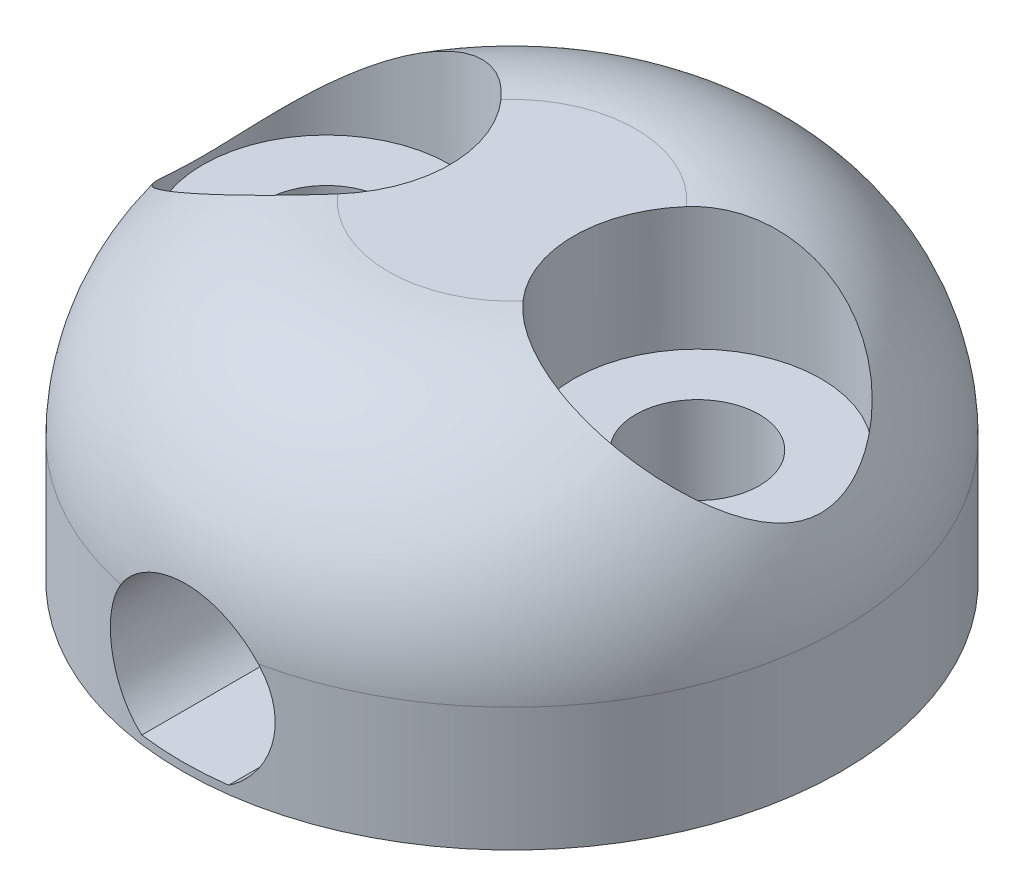
ISO-10303-21;
HEADER;
FILE_DESCRIPTION(('STEP AP214'),'2;1');
FILE_NAME('part.step','',(''),(''),'','','');
FILE_SCHEMA(('AUTOMOTIVE_DESIGN { 1 0 10303 214 1 1 1 1 }'));
ENDSEC;
DATA;
#1=APPLICATION_CONTEXT('core data for automotive mechanical design processes');
#2=APPLICATION_PROTOCOL_DEFINITION('international standard','automotive_design',2000,#1);
#3=PRODUCT_CONTEXT('',#1,'mechanical');
#4=PRODUCT('Part','Part','',(#3));
#5=PRODUCT_RELATED_PRODUCT_CATEGORY('part','',(#4));
#6=PRODUCT_DEFINITION_FORMATION('','',#4);
#7=PRODUCT_DEFINITION_CONTEXT('part definition',#1,'design');
#8=PRODUCT_DEFINITION('design','',#6,#7);
#9=PRODUCT_DEFINITION_SHAPE('','',#8);
#10=(LENGTH_UNIT() NAMED_UNIT(*) SI_UNIT(.MILLI.,.METRE.));
#11=(NAMED_UNIT(*) PLANE_ANGLE_UNIT() SI_UNIT($,.RADIAN.));
#12=(NAMED_UNIT(*) SI_UNIT($,.STERADIAN.) SOLID_ANGLE_UNIT());
#13=UNCERTAINTY_MEASURE_WITH_UNIT(LENGTH_MEASURE(1.E-05),#10,'distance_accuracy_value','');
#14=(GEOMETRIC_REPRESENTATION_CONTEXT(3) GLOBAL_UNCERTAINTY_ASSIGNED_CONTEXT((#13)) GLOBAL_UNIT_ASSIGNED_CONTEXT((#10,
#11,#12)) REPRESENTATION_CONTEXT('',''));
#15=CARTESIAN_POINT('',(0.,0.,0.));
#16=DIRECTION('',(0.,0.,1.));
#17=DIRECTION('',(1.,0.,0.));
#18=AXIS2_PLACEMENT_3D('',#15,#16,#17);
#19=CARTESIAN_POINT('',(-4.5,8.,0.));
#20=DIRECTION('',(0.,-1.,0.));
#21=DIRECTION('',(0.,0.,-1.));
#22=AXIS2_PLACEMENT_3D('',#19,#20,#21);
#23=CYLINDRICAL_SURFACE('',#22,1.5);
#24=CARTESIAN_POINT('',(-4.5,5.,0.));
#25=DIRECTION('',(0.,1.,0.));
#26=DIRECTION('',(0.,0.,1.));
#27=AXIS2_PLACEMENT_3D('',#24,#25,#26);
#28=CIRCLE('',#27,1.5);
#29=CARTESIAN_POINT('',(-4.5,5.,1.5));
#30=VERTEX_POINT('',#29);
#31=EDGE_CURVE('E154',#30,#30,#28,.T.);
#32=ORIENTED_EDGE('',*,*,#31,.T.);
#33=EDGE_LOOP('',(#32));
#34=FACE_BOUND('',#33,.T.);
#35=CARTESIAN_POINT('',(-4.5,0.2,0.));
#36=DIRECTION('',(0.,-1.,0.));
#37=DIRECTION('',(0.,0.,-1.));
#38=AXIS2_PLACEMENT_3D('',#35,#36,#37);
#39=CIRCLE('',#38,1.5);
#40=CARTESIAN_POINT('',(-4.5,0.2,-1.5));
#41=VERTEX_POINT('',#40);
#42=EDGE_CURVE('E176',#41,#41,#39,.T.);
#43=ORIENTED_EDGE('',*,*,#42,.T.);
#44=EDGE_LOOP('',(#43));
#45=FACE_BOUND('',#44,.T.);
#46=ADVANCED_FACE('F33',(#34,#45),#23,.F.);
#47=CARTESIAN_POINT('',(4.5,8.,0.));
#48=DIRECTION('',(0.,-1.,0.));
#49=DIRECTION('',(0.,0.,-1.));
#50=AXIS2_PLACEMENT_3D('',#47,#48,#49);
#51=CYLINDRICAL_SURFACE('',#50,1.5);
#52=CARTESIAN_POINT('',(4.5,5.,0.));
#53=DIRECTION('',(0.,1.,0.));
#54=DIRECTION('',(0.,0.,1.));
#55=AXIS2_PLACEMENT_3D('',#52,#53,#54);
#56=CIRCLE('',#55,1.5);
#57=CARTESIAN_POINT('',(4.5,5.,1.5));
#58=VERTEX_POINT('',#57);
#59=EDGE_CURVE('E158',#58,#58,#56,.T.);
#60=ORIENTED_EDGE('',*,*,#59,.T.);
#61=EDGE_LOOP('',(#60));
#62=FACE_BOUND('',#61,.T.);
#63=CARTESIAN_POINT('',(4.5,0.2,0.));
#64=DIRECTION('',(0.,-1.,0.));
#65=DIRECTION('',(0.,0.,-1.));
#66=AXIS2_PLACEMENT_3D('',#63,#64,#65);
#67=CIRCLE('',#66,1.5);
#68=CARTESIAN_POINT('',(4.5,0.2,-1.5));
#69=VERTEX_POINT('',#68);
#70=EDGE_CURVE('E151',#69,#69,#67,.T.);
#71=ORIENTED_EDGE('',*,*,#70,.T.);
#72=EDGE_LOOP('',(#71));
#73=FACE_BOUND('',#72,.T.);
#74=ADVANCED_FACE('F130',(#62,#73),#51,.F.);
#75=CARTESIAN_POINT('',(0.,1.9,-20.));
#76=DIRECTION('',(0.,0.,1.));
#77=DIRECTION('',(1.,0.,0.));
#78=AXIS2_PLACEMENT_3D('',#75,#76,#77);
#79=CYLINDRICAL_SURFACE('',#78,2.);
#80=DIRECTION('',(0.,0.,1.));
#81=VECTOR('',#80,1.);
#82=CARTESIAN_POINT('',(1.05356537528527,0.2,-20.));
#83=LINE('',#82,#81);
#84=CARTESIAN_POINT('',(1.05356537528527,0.2,7.93032155716273));
#85=VERTEX_POINT('',#84);
#86=CARTESIAN_POINT('',(1.05356537528527,0.2,-7.93032155716273));
#87=VERTEX_POINT('',#86);
#88=EDGE_CURVE('E11',#85,#87,#83,.F.);
#89=ORIENTED_EDGE('',*,*,#88,.F.);
#90=CARTESIAN_POINT('',(-0.62449979983984,0.,7.97558775263616));
#91=CARTESIAN_POINT('',(-0.678149129335903,0.0176338708204838,7.97138952109277));
#92=CARTESIAN_POINT('',(-0.730988103930921,0.0375201759389581,7.96670445516339));
#93=CARTESIAN_POINT('',(-0.834722214890457,0.0816441585373171,7.95650348799234));
#94=CARTESIAN_POINT('',(-0.885617719784912,0.105881006027599,7.95098774525815));
#95=CARTESIAN_POINT('',(-1.03473646986106,0.184793652290598,7.93342930658351));
#96=CARTESIAN_POINT('',(-1.12960818115426,0.245743039353849,7.9203575369683));
#97=CARTESIAN_POINT('',(-1.30761657189999,0.382516823465673,7.89292597702519));
#98=CARTESIAN_POINT('',(-1.39075491423208,0.458339109046076,7.87856636968526));
#99=CARTESIAN_POINT('',(-1.54321390243567,0.622869434850874,7.85012801299076));
#100=CARTESIAN_POINT('',(-1.61253356298505,0.71157839316272,7.83604928372819));
#101=CARTESIAN_POINT('',(-1.73604150350963,0.900489647836725,7.80962250525773));
#102=CARTESIAN_POINT('',(-1.79007366230755,1.00079675441443,7.79729291199089));
#103=CARTESIAN_POINT('',(-1.88043505641346,1.20943415952048,7.77599722688484));
#104=CARTESIAN_POINT('',(-1.91676591547244,1.31776372109357,7.76703082655527));
#105=CARTESIAN_POINT('',(-1.96997277466503,1.53710802979521,7.7537057006627));
#106=CARTESIAN_POINT('',(-1.98721818757998,1.64802774001858,7.74925962426297));
#107=CARTESIAN_POINT('',(-2.00292006881191,1.87126476685026,7.74521670418808));
#108=CARTESIAN_POINT('',(-2.00138028565928,1.98358180015833,7.74561889305572));
#109=CARTESIAN_POINT('',(-1.97984577158778,2.20351813997541,7.75114978848514));
#110=CARTESIAN_POINT('',(-1.96030361939172,2.3111851437969,7.75616257990297));
#111=CARTESIAN_POINT('',(-1.90404981227494,2.52166167717302,7.77016256734981));
#112=CARTESIAN_POINT('',(-1.86733675771861,2.62447081000029,7.77915008736387));
#113=CARTESIAN_POINT('',(-1.77742692977357,2.82346693213446,7.80018550940365));
#114=CARTESIAN_POINT('',(-1.72407436617985,2.9195803669078,7.81226213300263));
#115=CARTESIAN_POINT('',(-1.60250667793686,3.10164869791587,7.83810075600036));
#116=CARTESIAN_POINT('',(-1.53428901164841,3.18760185306202,7.85186304343793));
#117=CARTESIAN_POINT('',(-1.38261622441132,3.34949030371311,7.88000486237123));
#118=CARTESIAN_POINT('',(-1.29878144979904,3.42506922763394,7.89439079510434));
#119=CARTESIAN_POINT('',(-1.11946181887999,3.56116671678368,7.92180658273681));
#120=CARTESIAN_POINT('',(-1.02397655646946,3.62168475680824,7.93483639033606));
#121=CARTESIAN_POINT('',(-0.823510340305419,3.7261022057381,7.95814294692834));
#122=CARTESIAN_POINT('',(-0.718494022199052,3.76993630420429,7.96840883141241));
#123=CARTESIAN_POINT('',(-0.502269250813925,3.83922856929184,7.98495247709832));
#124=CARTESIAN_POINT('',(-0.391061982585458,3.86469023976127,7.99123099871194));
#125=CARTESIAN_POINT('',(-0.168646637723676,3.8959580104626,7.99897645571015));
#126=CARTESIAN_POINT('',(-0.0575105914191628,3.90224779022084,8.00056176389966));
#127=CARTESIAN_POINT('',(0.164229199224711,3.89632834875157,7.99908233024459));
#128=CARTESIAN_POINT('',(0.274832991846246,3.88412083845255,7.99601801847203));
#129=CARTESIAN_POINT('',(0.490634151381134,3.84195388834336,7.98566094348375));
#130=CARTESIAN_POINT('',(0.595888074450275,3.81226649988497,7.97843301801472));
#131=CARTESIAN_POINT('',(0.79991406809078,3.73629807599584,7.96056746453128));
#132=CARTESIAN_POINT('',(0.89868549198035,3.69001538801719,7.94992949695854));
#133=CARTESIAN_POINT('',(1.08885009494479,3.58125324198456,7.92614386401596));
#134=CARTESIAN_POINT('',(1.18008464247959,3.51850550617499,7.91295568223272));
#135=CARTESIAN_POINT('',(1.35090120441893,3.37893063427777,7.88559205638182));
#136=CARTESIAN_POINT('',(1.43048121423665,3.30210108121463,7.87141644309269));
#137=CARTESIAN_POINT('',(1.57775835209973,3.13427939332037,7.84324227492578));
#138=CARTESIAN_POINT('',(1.64511310393349,3.04298410720222,7.82925675944008));
#139=CARTESIAN_POINT('',(1.7635499306507,2.85010363984169,7.80343387023057));
#140=CARTESIAN_POINT('',(1.81463258658533,2.74851882619308,7.79159641980918));
#141=CARTESIAN_POINT('',(1.89871675181714,2.53843682964764,7.77153426173014));
#142=CARTESIAN_POINT('',(1.93181759620394,2.42998139583795,7.76328975701963));
#143=CARTESIAN_POINT('',(1.9792479234238,2.20880731659754,7.75133452293179));
#144=CARTESIAN_POINT('',(1.99358177601552,2.09608966988362,7.74762273815687));
#145=CARTESIAN_POINT('',(2.00284139579692,1.87306185683508,7.74523374524784));
#146=CARTESIAN_POINT('',(1.99831283676291,1.76277554266662,7.74641498061502));
#147=CARTESIAN_POINT('',(1.97123502093836,1.5445888867123,7.75334920658874));
#148=CARTESIAN_POINT('',(1.94868569070461,1.43668855465229,7.75910221582743));
#149=CARTESIAN_POINT('',(1.88651560478662,1.22698777986888,7.77444957412282));
#150=CARTESIAN_POINT('',(1.84700529741727,1.12515264474785,7.78401904261951));
#151=CARTESIAN_POINT('',(1.75212221074548,0.929487455070735,7.80592262429375));
#152=CARTESIAN_POINT('',(1.69674733361861,0.83565846132414,7.81825710305078));
#153=CARTESIAN_POINT('',(1.57000905230004,0.656028157162892,7.84470254219912));
#154=CARTESIAN_POINT('',(1.49826638752489,0.570499972753037,7.8588514388833));
#155=CARTESIAN_POINT('',(1.3415883150242,0.412546838452256,7.88710757512615));
#156=CARTESIAN_POINT('',(1.25665436092456,0.340120446698962,7.90121481910043));
#157=CARTESIAN_POINT('',(1.08378054493429,0.21604484346309,7.92668565083606));
#158=CARTESIAN_POINT('',(0.996776295410648,0.163122193756207,7.93818161951458));
#159=CARTESIAN_POINT('',(0.860894728808642,0.0940511090518631,7.95367523156273));
#160=CARTESIAN_POINT('',(0.81468115982457,0.0727383557995359,7.95854999489001));
#161=CARTESIAN_POINT('',(0.72069748029579,0.0336709209253033,7.96761126367671));
#162=CARTESIAN_POINT('',(0.672927049067981,0.015916977802848,7.97179762625168));
#163=CARTESIAN_POINT('',(0.62449979983984,0.,7.97558775263616));
#164=B_SPLINE_CURVE_WITH_KNOTS('',3,(#90,#91,#92,#93,#94,#95,#96,#97,#98,#99,#100,#101,#102,
#103,#104,#105,#106,#107,#108,#109,#110,#111,#112,#113,#114,#115,#116,#117,#118,#119,#120,#121,
#122,#123,#124,#125,#126,#127,#128,#129,#130,#131,#132,#133,#134,#135,#136,#137,#138,#139,#140,
#141,#142,#143,#144,#145,#146,#147,#148,#149,#150,#151,#152,#153,#154,#155,#156,#157,#158,#159,
#160,#161,#162,#163),.UNSPECIFIED.,.F.,.F.,(4,2,2,2,2,2,2,2,2,2,2,2,2,2,2,2,2,2,2,2,2,2,2,2,2,2,
2,2,2,2,2,2,2,2,2,2,4),(0.,0.169775823606109,0.339519292006739,0.678329792225753,
1.01709222713343,1.35587880839866,1.69800965559001,2.04010911299956,2.37546443342145,
2.7107528357744,3.03783557003932,3.36494497013899,3.69521390243794,4.02553934857664,
4.36530224823981,4.70507699448241,5.04616845788945,5.38719485375251,5.71954330081126,
6.05186100878804,6.37913846056119,6.70644851144086,7.03946422650503,7.37253715335021,
7.71384367977885,8.05513801731667,8.39452729275183,8.73383752978051,9.06340101174411,
9.39296583684271,9.72041636756288,10.0479102181487,10.3839437066388,10.7199401918574,
11.0261197680304,11.1793590762489,11.3326301507749),.UNSPECIFIED.);
#165=CARTESIAN_POINT('',(1.67032930884901,3.,7.82368199762746));
#166=VERTEX_POINT('',#165);
#167=EDGE_CURVE('E150',#166,#85,#164,.T.);
#168=ORIENTED_EDGE('',*,*,#167,.F.);
#169=CARTESIAN_POINT('',(1.67032930884901,3.,7.82368199762746));
#170=CARTESIAN_POINT('',(1.63974251917367,3.04644603889821,7.83021288302331));
#171=CARTESIAN_POINT('',(1.6072032091388,3.09163550278727,7.83630939706052));
#172=CARTESIAN_POINT('',(1.53841904952875,3.17920658150868,7.84768511472171));
#173=CARTESIAN_POINT('',(1.50217436934382,3.22158832454956,7.85296435567944));
#174=CARTESIAN_POINT('',(1.38830477431373,3.34394890242695,7.86763768048863));
#175=CARTESIAN_POINT('',(1.30544012802177,3.41930117699998,7.87588896965515));
#176=CARTESIAN_POINT('',(1.12816855248475,3.55521434691073,7.88979213570129));
#177=CARTESIAN_POINT('',(1.03375584169712,3.61576778734984,7.89544270373081));
#178=CARTESIAN_POINT('',(0.836076546342191,3.72029313464337,7.90464621969626));
#179=CARTESIAN_POINT('',(0.732811785173716,3.76426844633533,7.90819959844051));
#180=CARTESIAN_POINT('',(0.520312858595372,3.8343732360506,7.91364308769088));
#181=CARTESIAN_POINT('',(0.411076477658144,3.86049604142641,7.91553257636866));
#182=CARTESIAN_POINT('',(0.189734689434183,3.89412479271695,7.91793433448282));
#183=CARTESIAN_POINT('',(0.0776286429377334,3.90162655374206,7.91844629433583));
#184=CARTESIAN_POINT('',(-0.146459806863289,3.89778119133218,7.9181785857226));
#185=CARTESIAN_POINT('',(-0.258441628602604,3.886400266802,7.9173966010278));
#186=CARTESIAN_POINT('',(-0.478881350600388,3.84505681992554,7.91440549328976));
#187=CARTESIAN_POINT('',(-0.587339866659163,3.81509756327329,7.91219662106156));
#188=CARTESIAN_POINT('',(-0.797674918103802,3.73746609987292,7.90602659387854));
#189=CARTESIAN_POINT('',(-0.899551132136076,3.68979302908719,7.90206535344558));
#190=CARTESIAN_POINT('',(-1.09381406336721,3.57813072978673,7.89193280886461));
#191=CARTESIAN_POINT('',(-1.18620065308591,3.51414128212393,7.88576147503202));
#192=CARTESIAN_POINT('',(-1.349535720118,3.37943068345248,7.87151344375509));
#193=CARTESIAN_POINT('',(-1.42172173442734,3.31018042674242,7.86371411365722));
#194=CARTESIAN_POINT('',(-1.52151879650722,3.19902581189728,7.85015474124726));
#195=CARTESIAN_POINT('',(-1.55337814138417,3.16074996042402,7.84532336054342));
#196=CARTESIAN_POINT('',(-1.61412184646069,3.08198289988643,7.83500405425471));
#197=CARTESIAN_POINT('',(-1.64300587680294,3.04149144595035,7.82951605601962));
#198=CARTESIAN_POINT('',(-1.67032930884901,3.,7.82368199762746));
#199=B_SPLINE_CURVE_WITH_KNOTS('',3,(#169,#170,#171,#172,#173,#174,#175,#176,#177,#178,#179,
#180,#181,#182,#183,#184,#185,#186,#187,#188,#189,#190,#191,#192,#193,#194,#195,#196,#197,#198),
.UNSPECIFIED.,.F.,.F.,(4,2,2,2,2,2,2,2,2,2,2,2,2,2,4),(0.,0.167882493564761,0.3357573158445,
0.670942577401621,1.00629634177959,1.34158119319558,1.67699129401933,2.01247676801691,
2.34856342850184,2.68459102850685,3.02063502128871,3.35668352777298,3.65647972827028,
3.80645733492145,3.95645155093791),.UNSPECIFIED.);
#200=CARTESIAN_POINT('',(-1.67032930884901,3.,7.82368199762746));
#201=VERTEX_POINT('',#200);
#202=EDGE_CURVE('E49',#166,#201,#199,.T.);
#203=ORIENTED_EDGE('',*,*,#202,.T.);
#204=CARTESIAN_POINT('',(-1.05356537528527,0.2,7.93032155716273));
#205=VERTEX_POINT('',#204);
#206=EDGE_CURVE('E57',#205,#201,#164,.T.);
#207=ORIENTED_EDGE('',*,*,#206,.F.);
#208=DIRECTION('',(0.,0.,1.));
#209=VECTOR('',#208,1.);
#210=CARTESIAN_POINT('',(-1.05356537528527,0.2,-20.));
#211=LINE('',#210,#209);
#212=CARTESIAN_POINT('',(-1.05356537528527,0.2,-7.93032155716273));
#213=VERTEX_POINT('',#212);
#214=EDGE_CURVE('E42',#213,#205,#211,.T.);
#215=ORIENTED_EDGE('',*,*,#214,.F.);
#216=CARTESIAN_POINT('',(0.62449979983984,0.,-7.97558775263616));
#217=CARTESIAN_POINT('',(0.678149129335903,0.0176338708204838,-7.97138952109277));
#218=CARTESIAN_POINT('',(0.730988103930921,0.0375201759389581,-7.96670445516339));
#219=CARTESIAN_POINT('',(0.834722214890457,0.0816441585373171,-7.95650348799234));
#220=CARTESIAN_POINT('',(0.885617719784912,0.105881006027599,-7.95098774525815));
#221=CARTESIAN_POINT('',(1.03473646986106,0.184793652290598,-7.93342930658351));
#222=CARTESIAN_POINT('',(1.12960818115426,0.245743039353849,-7.9203575369683));
#223=CARTESIAN_POINT('',(1.30761657189999,0.382516823465673,-7.89292597702519));
#224=CARTESIAN_POINT('',(1.39075491423208,0.458339109046076,-7.87856636968526));
#225=CARTESIAN_POINT('',(1.54321390243567,0.622869434850874,-7.85012801299076));
#226=CARTESIAN_POINT('',(1.61253356298505,0.71157839316272,-7.83604928372819));
#227=CARTESIAN_POINT('',(1.73604150350963,0.900489647836725,-7.80962250525773));
#228=CARTESIAN_POINT('',(1.79007366230755,1.00079675441443,-7.79729291199089));
#229=CARTESIAN_POINT('',(1.88043505641346,1.20943415952048,-7.77599722688484));
#230=CARTESIAN_POINT('',(1.91676591547244,1.31776372109357,-7.76703082655527));
#231=CARTESIAN_POINT('',(1.96997277466503,1.53710802979521,-7.7537057006627));
#232=CARTESIAN_POINT('',(1.98721818757998,1.64802774001858,-7.74925962426297));
#233=CARTESIAN_POINT('',(2.00292006881191,1.87126476685026,-7.74521670418808));
#234=CARTESIAN_POINT('',(2.00138028565928,1.98358180015833,-7.74561889305572));
#235=CARTESIAN_POINT('',(1.97984577158778,2.20351813997541,-7.75114978848514));
#236=CARTESIAN_POINT('',(1.96030361939172,2.3111851437969,-7.75616257990297));
#237=CARTESIAN_POINT('',(1.90404981227494,2.52166167717302,-7.77016256734981));
#238=CARTESIAN_POINT('',(1.86733675771861,2.62447081000029,-7.77915008736387));
#239=CARTESIAN_POINT('',(1.77742692977357,2.82346693213446,-7.80018550940365));
#240=CARTESIAN_POINT('',(1.72407436617985,2.9195803669078,-7.81226213300263));
#241=CARTESIAN_POINT('',(1.60250667793686,3.10164869791587,-7.83810075600036));
#242=CARTESIAN_POINT('',(1.53428901164841,3.18760185306202,-7.85186304343793));
#243=CARTESIAN_POINT('',(1.38261622441132,3.34949030371311,-7.88000486237123));
#244=CARTESIAN_POINT('',(1.29878144979904,3.42506922763394,-7.89439079510434));
#245=CARTESIAN_POINT('',(1.11946181887999,3.56116671678368,-7.92180658273681));
#246=CARTESIAN_POINT('',(1.02397655646946,3.62168475680824,-7.93483639033606));
#247=CARTESIAN_POINT('',(0.823510340305419,3.7261022057381,-7.95814294692834));
#248=CARTESIAN_POINT('',(0.718494022199052,3.76993630420429,-7.96840883141241));
#249=CARTESIAN_POINT('',(0.502269250813925,3.83922856929184,-7.98495247709832));
#250=CARTESIAN_POINT('',(0.391061982585458,3.86469023976127,-7.99123099871194));
#251=CARTESIAN_POINT('',(0.168646637723676,3.8959580104626,-7.99897645571015));
#252=CARTESIAN_POINT('',(0.0575105914191628,3.90224779022084,-8.00056176389966));
#253=CARTESIAN_POINT('',(-0.164229199224711,3.89632834875157,-7.99908233024459));
#254=CARTESIAN_POINT('',(-0.274832991846246,3.88412083845255,-7.99601801847203));
#255=CARTESIAN_POINT('',(-0.490634151381134,3.84195388834336,-7.98566094348375));
#256=CARTESIAN_POINT('',(-0.595888074450275,3.81226649988497,-7.97843301801472));
#257=CARTESIAN_POINT('',(-0.79991406809078,3.73629807599584,-7.96056746453128));
#258=CARTESIAN_POINT('',(-0.89868549198035,3.69001538801719,-7.94992949695854));
#259=CARTESIAN_POINT('',(-1.08885009494479,3.58125324198456,-7.92614386401596));
#260=CARTESIAN_POINT('',(-1.18008464247959,3.51850550617499,-7.91295568223272));
#261=CARTESIAN_POINT('',(-1.35090120441893,3.37893063427777,-7.88559205638182));
#262=CARTESIAN_POINT('',(-1.43048121423665,3.30210108121463,-7.87141644309269));
#263=CARTESIAN_POINT('',(-1.57775835209973,3.13427939332037,-7.84324227492578));
#264=CARTESIAN_POINT('',(-1.64511310393349,3.04298410720222,-7.82925675944008));
#265=CARTESIAN_POINT('',(-1.7635499306507,2.85010363984169,-7.80343387023057));
#266=CARTESIAN_POINT('',(-1.81463258658533,2.74851882619308,-7.79159641980918));
#267=CARTESIAN_POINT('',(-1.89871675181714,2.53843682964764,-7.77153426173014));
#268=CARTESIAN_POINT('',(-1.93181759620394,2.42998139583795,-7.76328975701963));
#269=CARTESIAN_POINT('',(-1.9792479234238,2.20880731659754,-7.75133452293179));
#270=CARTESIAN_POINT('',(-1.99358177601552,2.09608966988362,-7.74762273815687));
#271=CARTESIAN_POINT('',(-2.00284139579692,1.87306185683508,-7.74523374524784));
#272=CARTESIAN_POINT('',(-1.99831283676291,1.76277554266662,-7.74641498061502));
#273=CARTESIAN_POINT('',(-1.97123502093836,1.5445888867123,-7.75334920658874));
#274=CARTESIAN_POINT('',(-1.94868569070461,1.43668855465229,-7.75910221582743));
#275=CARTESIAN_POINT('',(-1.88651560478662,1.22698777986888,-7.77444957412282));
#276=CARTESIAN_POINT('',(-1.84700529741727,1.12515264474785,-7.78401904261951));
#277=CARTESIAN_POINT('',(-1.75212221074548,0.929487455070735,-7.80592262429375));
#278=CARTESIAN_POINT('',(-1.69674733361861,0.83565846132414,-7.81825710305078));
#279=CARTESIAN_POINT('',(-1.57000905230004,0.656028157162892,-7.84470254219912));
#280=CARTESIAN_POINT('',(-1.49826638752489,0.570499972753037,-7.8588514388833));
#281=CARTESIAN_POINT('',(-1.3415883150242,0.412546838452256,-7.88710757512615));
#282=CARTESIAN_POINT('',(-1.25665436092456,0.340120446698962,-7.90121481910043));
#283=CARTESIAN_POINT('',(-1.08378054493429,0.21604484346309,-7.92668565083606));
#284=CARTESIAN_POINT('',(-0.996776295410648,0.163122193756207,-7.93818161951458));
#285=CARTESIAN_POINT('',(-0.860894728808642,0.0940511090518631,-7.95367523156273));
#286=CARTESIAN_POINT('',(-0.81468115982457,0.0727383557995359,-7.95854999489001));
#287=CARTESIAN_POINT('',(-0.72069748029579,0.0336709209253033,-7.96761126367671));
#288=CARTESIAN_POINT('',(-0.672927049067981,0.015916977802848,-7.97179762625168));
#289=CARTESIAN_POINT('',(-0.62449979983984,0.,-7.97558775263616));
#290=B_SPLINE_CURVE_WITH_KNOTS('',3,(#216,#217,#218,#219,#220,#221,#222,#223,#224,#225,#226,
#227,#228,#229,#230,#231,#232,#233,#234,#235,#236,#237,#238,#239,#240,#241,#242,#243,#244,#245,
#246,#247,#248,#249,#250,#251,#252,#253,#254,#255,#256,#257,#258,#259,#260,#261,#262,#263,#264,
#265,#266,#267,#268,#269,#270,#271,#272,#273,#274,#275,#276,#277,#278,#279,#280,#281,#282,#283,
#284,#285,#286,#287,#288,#289),.UNSPECIFIED.,.F.,.F.,(4,2,2,2,2,2,2,2,2,2,2,2,2,2,2,2,2,2,2,2,2,
2,2,2,2,2,2,2,2,2,2,2,2,2,2,2,4),(0.,0.169775823606109,0.339519292006739,0.678329792225753,
1.01709222713343,1.35587880839866,1.69800965559001,2.04010911299956,2.37546443342145,
2.7107528357744,3.03783557003932,3.36494497013899,3.69521390243794,4.02553934857664,
4.36530224823981,4.70507699448241,5.04616845788945,5.38719485375251,5.71954330081126,
6.05186100878804,6.37913846056119,6.70644851144086,7.03946422650503,7.37253715335021,
7.71384367977885,8.05513801731667,8.39452729275183,8.73383752978051,9.06340101174411,
9.39296583684271,9.72041636756288,10.0479102181487,10.3839437066388,10.7199401918574,
11.0261197680304,11.1793590762489,11.3326301507749),.UNSPECIFIED.);
#291=CARTESIAN_POINT('',(-1.67032930884901,3.,-7.82368199762746));
#292=VERTEX_POINT('',#291);
#293=EDGE_CURVE('E102',#292,#213,#290,.T.);
#294=ORIENTED_EDGE('',*,*,#293,.F.);
#295=CARTESIAN_POINT('',(-1.67032930884901,3.,-7.82368199762746));
#296=CARTESIAN_POINT('',(-1.63974251917367,3.04644603889821,-7.83021288302331));
#297=CARTESIAN_POINT('',(-1.6072032091388,3.09163550278727,-7.83630939706052));
#298=CARTESIAN_POINT('',(-1.53841904952875,3.17920658150868,-7.84768511472171));
#299=CARTESIAN_POINT('',(-1.50217436934382,3.22158832454956,-7.85296435567944));
#300=CARTESIAN_POINT('',(-1.38830477431373,3.34394890242695,-7.86763768048863));
#301=CARTESIAN_POINT('',(-1.30544012802177,3.41930117699998,-7.87588896965515));
#302=CARTESIAN_POINT('',(-1.12816855248475,3.55521434691073,-7.88979213570129));
#303=CARTESIAN_POINT('',(-1.03375584169712,3.61576778734984,-7.89544270373081));
#304=CARTESIAN_POINT('',(-0.836076546342191,3.72029313464337,-7.90464621969626));
#305=CARTESIAN_POINT('',(-0.732811785173716,3.76426844633533,-7.90819959844051));
#306=CARTESIAN_POINT('',(-0.520312858595372,3.8343732360506,-7.91364308769088));
#307=CARTESIAN_POINT('',(-0.411076477658144,3.86049604142641,-7.91553257636866));
#308=CARTESIAN_POINT('',(-0.189734689434183,3.89412479271695,-7.91793433448282));
#309=CARTESIAN_POINT('',(-0.0776286429377334,3.90162655374206,-7.91844629433583));
#310=CARTESIAN_POINT('',(0.146459806863289,3.89778119133218,-7.9181785857226));
#311=CARTESIAN_POINT('',(0.258441628602604,3.886400266802,-7.9173966010278));
#312=CARTESIAN_POINT('',(0.478881350600388,3.84505681992554,-7.91440549328976));
#313=CARTESIAN_POINT('',(0.587339866659163,3.81509756327329,-7.91219662106156));
#314=CARTESIAN_POINT('',(0.797674918103802,3.73746609987292,-7.90602659387854));
#315=CARTESIAN_POINT('',(0.899551132136076,3.68979302908719,-7.90206535344558));
#316=CARTESIAN_POINT('',(1.09381406336721,3.57813072978673,-7.89193280886461));
#317=CARTESIAN_POINT('',(1.18620065308591,3.51414128212393,-7.88576147503202));
#318=CARTESIAN_POINT('',(1.349535720118,3.37943068345248,-7.87151344375509));
#319=CARTESIAN_POINT('',(1.42172173442734,3.31018042674242,-7.86371411365722));
#320=CARTESIAN_POINT('',(1.52151879650722,3.19902581189728,-7.85015474124726));
#321=CARTESIAN_POINT('',(1.55337814138417,3.16074996042402,-7.84532336054342));
#322=CARTESIAN_POINT('',(1.61412184646069,3.08198289988643,-7.83500405425471));
#323=CARTESIAN_POINT('',(1.64300587680294,3.04149144595035,-7.82951605601962));
#324=CARTESIAN_POINT('',(1.67032930884901,3.,-7.82368199762746));
#325=B_SPLINE_CURVE_WITH_KNOTS('',3,(#295,#296,#297,#298,#299,#300,#301,#302,#303,#304,#305,
#306,#307,#308,#309,#310,#311,#312,#313,#314,#315,#316,#317,#318,#319,#320,#321,#322,#323,#324),
.UNSPECIFIED.,.F.,.F.,(4,2,2,2,2,2,2,2,2,2,2,2,2,2,4),(0.,0.167882493564761,0.3357573158445,
0.670942577401621,1.00629634177959,1.34158119319558,1.67699129401933,2.01247676801691,
2.34856342850184,2.68459102850685,3.02063502128871,3.35668352777298,3.65647972827028,
3.80645733492145,3.95645155093791),.UNSPECIFIED.);
#326=CARTESIAN_POINT('',(1.67032930884901,3.,-7.82368199762746));
#327=VERTEX_POINT('',#326);
#328=EDGE_CURVE('E106',#292,#327,#325,.T.);
#329=ORIENTED_EDGE('',*,*,#328,.T.);
#330=EDGE_CURVE('E99',#87,#327,#290,.T.);
#331=ORIENTED_EDGE('',*,*,#330,.F.);
#332=EDGE_LOOP('',(#89,#168,#203,#207,#215,#294,#329,#331));
#333=FACE_BOUND('',#332,.T.);
#334=ADVANCED_FACE('F104',(#333),#79,.F.);
#335=CARTESIAN_POINT('',(0.,8.,0.));
#336=DIRECTION('',(0.,1.,0.));
#337=DIRECTION('',(0.,0.,1.));
#338=AXIS2_PLACEMENT_3D('',#335,#336,#337);
#339=PLANE('',#338);
#340=CARTESIAN_POINT('',(-4.5,8.,0.));
#341=DIRECTION('',(0.,1.,0.));
#342=DIRECTION('',(0.,0.,1.));
#343=AXIS2_PLACEMENT_3D('',#340,#341,#342);
#344=CIRCLE('',#343,3.);
#345=CARTESIAN_POINT('',(-2.25,8.,1.98431348329844));
#346=VERTEX_POINT('',#345);
#347=CARTESIAN_POINT('',(-2.25,8.,-1.98431348329844));
#348=VERTEX_POINT('',#347);
#349=EDGE_CURVE('E168',#346,#348,#344,.T.);
#350=ORIENTED_EDGE('',*,*,#349,.F.);
#351=CARTESIAN_POINT('',(0.,8.,0.));
#352=DIRECTION('',(0.,1.,0.));
#353=DIRECTION('',(0.,0.,1.));
#354=AXIS2_PLACEMENT_3D('',#351,#352,#353);
#355=CIRCLE('',#354,3.);
#356=CARTESIAN_POINT('',(2.25,8.,1.98431348329844));
#357=VERTEX_POINT('',#356);
#358=EDGE_CURVE('E109',#346,#357,#355,.T.);
#359=ORIENTED_EDGE('',*,*,#358,.T.);
#360=CARTESIAN_POINT('',(4.5,8.,0.));
#361=DIRECTION('',(0.,1.,0.));
#362=DIRECTION('',(0.,0.,1.));
#363=AXIS2_PLACEMENT_3D('',#360,#361,#362);
#364=CIRCLE('',#363,3.);
#365=CARTESIAN_POINT('',(2.25,8.,-1.98431348329844));
#366=VERTEX_POINT('',#365);
#367=EDGE_CURVE('E161',#366,#357,#364,.T.);
#368=ORIENTED_EDGE('',*,*,#367,.F.);
#369=CARTESIAN_POINT('',(0.,8.,0.));
#370=DIRECTION('',(0.,1.,0.));
#371=DIRECTION('',(0.,0.,1.));
#372=AXIS2_PLACEMENT_3D('',#369,#370,#371);
#373=CIRCLE('',#372,3.);
#374=EDGE_CURVE('E107',#366,#348,#373,.T.);
#375=ORIENTED_EDGE('',*,*,#374,.T.);
#376=EDGE_LOOP('',(#350,#359,#368,#375));
#377=FACE_BOUND('',#376,.T.);
#378=ADVANCED_FACE('F129',(#377),#339,.T.);
#379=CARTESIAN_POINT('',(0.,0.,0.));
#380=DIRECTION('',(0.,1.,0.));
#381=DIRECTION('',(0.,0.,1.));
#382=AXIS2_PLACEMENT_3D('',#379,#380,#381);
#383=PLANE('',#382);
#384=CARTESIAN_POINT('',(0.,0.,0.));
#385=DIRECTION('',(0.,1.,0.));
#386=DIRECTION('',(0.,0.,1.));
#387=AXIS2_PLACEMENT_3D('',#384,#385,#386);
#388=CIRCLE('',#387,8.);
#389=CARTESIAN_POINT('',(0.,0.,8.));
#390=VERTEX_POINT('',#389);
#391=EDGE_CURVE('E152',#390,#390,#388,.T.);
#392=ORIENTED_EDGE('',*,*,#391,.F.);
#393=EDGE_LOOP('',(#392));
#394=FACE_BOUND('',#393,.T.);
#395=ADVANCED_FACE('F209',(#394),#383,.F.);
#396=CARTESIAN_POINT('',(0.,8.,0.));
#397=DIRECTION('',(0.,-1.,0.));
#398=DIRECTION('',(0.,0.,-1.));
#399=AXIS2_PLACEMENT_3D('',#396,#397,#398);
#400=CYLINDRICAL_SURFACE('',#399,8.);
#401=CARTESIAN_POINT('',(0.,0.2,0.));
#402=DIRECTION('',(0.,-1.,0.));
#403=DIRECTION('',(0.,0.,-1.));
#404=AXIS2_PLACEMENT_3D('',#401,#402,#403);
#405=CIRCLE('',#404,8.);
#406=EDGE_CURVE('E91',#85,#205,#405,.T.);
#407=ORIENTED_EDGE('',*,*,#406,.T.);
#408=ORIENTED_EDGE('',*,*,#206,.T.);
#409=CARTESIAN_POINT('',(0.,3.,0.));
#410=DIRECTION('',(0.,1.,0.));
#411=DIRECTION('',(0.,0.,1.));
#412=AXIS2_PLACEMENT_3D('',#409,#410,#411);
#413=CIRCLE('',#412,8.);
#414=EDGE_CURVE('E242',#201,#292,#413,.F.);
#415=ORIENTED_EDGE('',*,*,#414,.T.);
#416=ORIENTED_EDGE('',*,*,#293,.T.);
#417=EDGE_CURVE('E89',#213,#87,#405,.T.);
#418=ORIENTED_EDGE('',*,*,#417,.T.);
#419=ORIENTED_EDGE('',*,*,#330,.T.);
#420=CARTESIAN_POINT('',(0.,3.,0.));
#421=DIRECTION('',(0.,1.,0.));
#422=DIRECTION('',(0.,0.,1.));
#423=AXIS2_PLACEMENT_3D('',#420,#421,#422);
#424=CIRCLE('',#423,8.);
#425=EDGE_CURVE('E144',#327,#166,#424,.F.);
#426=ORIENTED_EDGE('',*,*,#425,.T.);
#427=ORIENTED_EDGE('',*,*,#167,.T.);
#428=EDGE_LOOP('',(#407,#408,#415,#416,#418,#419,#426,#427));
#429=FACE_BOUND('',#428,.T.);
#430=ORIENTED_EDGE('',*,*,#391,.T.);
#431=EDGE_LOOP('',(#430));
#432=FACE_BOUND('',#431,.T.);
#433=ADVANCED_FACE('F97',(#429,#432),#400,.T.);
#434=CARTESIAN_POINT('',(4.5,5.,0.));
#435=DIRECTION('',(0.,1.,0.));
#436=DIRECTION('',(0.,0.,1.));
#437=AXIS2_PLACEMENT_3D('',#434,#435,#436);
#438=CYLINDRICAL_SURFACE('',#437,3.);
#439=CARTESIAN_POINT('',(4.5,5.,0.));
#440=DIRECTION('',(0.,1.,0.));
#441=DIRECTION('',(0.,0.,1.));
#442=AXIS2_PLACEMENT_3D('',#439,#440,#441);
#443=CIRCLE('',#442,3.);
#444=CARTESIAN_POINT('',(4.5,5.,3.));
#445=VERTEX_POINT('',#444);
#446=EDGE_CURVE('E173',#445,#445,#443,.T.);
#447=ORIENTED_EDGE('',*,*,#446,.F.);
#448=EDGE_LOOP('',(#447));
#449=FACE_BOUND('',#448,.T.);
#450=ORIENTED_EDGE('',*,*,#367,.T.);
#451=CARTESIAN_POINT('',(2.25,8.,1.98431348329844));
#452=CARTESIAN_POINT('',(2.29200450903828,8.0000055449156,2.03194665140561));
#453=CARTESIAN_POINT('',(2.33551327049125,7.99880795714106,2.07822611938995));
#454=CARTESIAN_POINT('',(2.42529704433942,7.99399865570984,2.16786276500938));
#455=CARTESIAN_POINT('',(2.47157137511387,7.99038753469262,2.21122065715667));
#456=CARTESIAN_POINT('',(2.61393610937036,7.97594915168475,2.33638170842558));
#457=CARTESIAN_POINT('',(2.71381432907212,7.96151695564499,2.41355050596144));
#458=CARTESIAN_POINT('',(2.93662298062243,7.92068755994785,2.56447892216081));
#459=CARTESIAN_POINT('',(3.06077503227149,7.89283287405166,2.636034145068));
#460=CARTESIAN_POINT('',(3.31565047998596,7.82635082546054,2.75996964988821));
#461=CARTESIAN_POINT('',(3.44637962509216,7.78771389902956,2.81233281281365));
#462=CARTESIAN_POINT('',(3.72001812172323,7.69825195841292,2.90063420840263));
#463=CARTESIAN_POINT('',(3.8631509167349,7.64677641704485,2.93521207867689));
#464=CARTESIAN_POINT('',(4.14955550707464,7.53514157386664,2.98300145400915));
#465=CARTESIAN_POINT('',(4.29282733550964,7.47497864516252,2.99620400683974));
#466=CARTESIAN_POINT('',(4.59537846997803,7.33928740275832,3.00278342279718));
#467=CARTESIAN_POINT('',(4.75427829474412,7.26277904639207,2.99331742534665));
#468=CARTESIAN_POINT('',(5.06528968797756,7.1030934188188,2.95044471204727));
#469=CARTESIAN_POINT('',(5.21739871952304,7.01991368722305,2.91702912725135));
#470=CARTESIAN_POINT('',(5.53368552665126,6.83648846967526,2.8218035606434));
#471=CARTESIAN_POINT('',(5.69641666306939,6.73551697620927,2.7565798212099));
#472=CARTESIAN_POINT('',(6.00673281660598,6.53033022275577,2.60000332355794));
#473=CARTESIAN_POINT('',(6.15430008033938,6.4261113426687,2.50862040215558));
#474=CARTESIAN_POINT('',(6.4473219887303,6.2059209429744,2.29020314670939));
#475=CARTESIAN_POINT('',(6.59065319542891,6.08995228761869,2.16030689157126));
#476=CARTESIAN_POINT('',(6.85182111958416,5.86389760488592,1.87261040869362));
#477=CARTESIAN_POINT('',(6.96968122037518,5.75380625247548,1.71483601801287));
#478=CARTESIAN_POINT('',(7.1398814581858,5.58470112747966,1.4311366960179));
#479=CARTESIAN_POINT('',(7.20079468887346,5.52117392706492,1.31301738025543));
#480=CARTESIAN_POINT('',(7.30780406418692,5.40545376230789,1.06507849719329));
#481=CARTESIAN_POINT('',(7.35392883709415,5.35323896317588,0.935282166662908));
#482=CARTESIAN_POINT('',(7.42052270111829,5.27586629292254,0.694642911458501));
#483=CARTESIAN_POINT('',(7.44439707496667,5.24728809022816,0.585866578568182));
#484=CARTESIAN_POINT('',(7.4799917634432,5.20420320390612,0.363668587469403));
#485=CARTESIAN_POINT('',(7.49173140807927,5.18967414309794,0.250254617359735));
#486=CARTESIAN_POINT('',(7.50211900929185,5.17683592378546,0.0213283432473839));
#487=CARTESIAN_POINT('',(7.50070535866944,5.1786030929648,-0.0941913032746084));
#488=CARTESIAN_POINT('',(7.48477574571956,5.19824208006244,-0.322960976010521));
#489=CARTESIAN_POINT('',(7.47024603329383,5.21613079882089,-0.436208492869355));
#490=CARTESIAN_POINT('',(7.42517766134715,5.27027748688093,-0.679355467178236));
#491=CARTESIAN_POINT('',(7.39203296168536,5.30947774109353,-0.808096005459685));
#492=CARTESIAN_POINT('',(7.31112154568689,5.40147646026794,-1.05577873479631));
#493=CARTESIAN_POINT('',(7.26331966014559,5.45430758295994,-1.1746964757249));
#494=CARTESIAN_POINT('',(7.13206661497197,5.59311833666523,-1.45070002568944));
#495=CARTESIAN_POINT('',(7.0421091956457,5.68361901714822,-1.60239764615024));
#496=CARTESIAN_POINT('',(6.84069146293445,5.87313463088596,-1.8844716901187));
#497=CARTESIAN_POINT('',(6.72921336099864,5.97215656984685,-2.01483030937589));
#498=CARTESIAN_POINT('',(6.48395169824285,6.17617179686387,-2.25708503496596));
#499=CARTESIAN_POINT('',(6.34963044831075,6.2812546635832,-2.36836113120839));
#500=CARTESIAN_POINT('',(6.06346407901561,6.49075321972133,-2.56629040126366));
#501=CARTESIAN_POINT('',(5.91161672698565,6.59516882234466,-2.65294043305971));
#502=CARTESIAN_POINT('',(5.57272338997976,6.81322311707827,-2.80861125770084));
#503=CARTESIAN_POINT('',(5.38365584812786,6.92635148109243,-2.87400119609372));
#504=CARTESIAN_POINT('',(4.99129490642337,7.1434075329926,-2.96633360440005));
#505=CARTESIAN_POINT('',(4.7880135040894,7.24734281657549,-2.99330809835954));
#506=CARTESIAN_POINT('',(4.4209941750461,7.41922156470641,-3.00323328516987));
#507=CARTESIAN_POINT('',(4.25878107095651,7.4899738931178,-2.99480322230979));
#508=CARTESIAN_POINT('',(3.93356764036499,7.62079475673052,-2.95058990944881));
#509=CARTESIAN_POINT('',(3.77056774136214,7.68086854153981,-2.91482014582972));
#510=CARTESIAN_POINT('',(3.52885266387926,7.76106905901935,-2.83973662333016));
#511=CARTESIAN_POINT('',(3.44840800708314,7.78623671953151,-2.81096809210737));
#512=CARTESIAN_POINT('',(3.28937006382034,7.832812352559,-2.74622112173666));
#513=CARTESIAN_POINT('',(3.21077581907459,7.85422230989892,-2.71024651048484));
#514=CARTESIAN_POINT('',(3.05629637488092,7.89292731660261,-2.63120512869759));
#515=CARTESIAN_POINT('',(2.98040816489078,7.9102270683181,-2.58814655911381));
#516=CARTESIAN_POINT('',(2.83210267147143,7.94043929379142,-2.49515087771032));
#517=CARTESIAN_POINT('',(2.7596837615035,7.95335384113582,-2.44521703267523));
#518=CARTESIAN_POINT('',(2.60997677484312,7.97594548850843,-2.33189114073011));
#519=CARTESIAN_POINT('',(2.53327053988296,7.98498774736913,-2.26759373978013));
#520=CARTESIAN_POINT('',(2.42316957559675,7.99400994642185,-2.16547662913968));
#521=CARTESIAN_POINT('',(2.38728839344761,7.99626047644297,-2.13048420242062));
#522=CARTESIAN_POINT('',(2.31729247362385,7.99925646443828,-2.05871315178245));
#523=CARTESIAN_POINT('',(2.28317775064974,8.00000190988908,-2.02193451300336));
#524=CARTESIAN_POINT('',(2.25,8.,-1.98431348329844));
#525=B_SPLINE_CURVE_WITH_KNOTS('',3,(#451,#452,#453,#454,#455,#456,#457,#458,#459,#460,#461,
#462,#463,#464,#465,#466,#467,#468,#469,#470,#471,#472,#473,#474,#475,#476,#477,#478,#479,#480,
#481,#482,#483,#484,#485,#486,#487,#488,#489,#490,#491,#492,#493,#494,#495,#496,#497,#498,#499,
#500,#501,#502,#503,#504,#505,#506,#507,#508,#509,#510,#511,#512,#513,#514,#515,#516,#517,#518,
#519,#520,#521,#522,#523,#524),.UNSPECIFIED.,.F.,.F.,(4,2,2,2,2,2,2,2,2,2,2,2,2,2,2,2,2,2,2,2,2,
2,2,2,2,2,2,2,2,2,2,2,2,2,2,2,4),(0.,0.190440767483937,0.380834789694379,0.760519532702201,
1.19653533655898,1.63293911793234,2.09904318616425,2.56534241366072,3.09310968225373,
3.62107249325717,4.22556543290437,4.83075821814017,5.5043450510629,6.17731085671212,
6.61797608782067,7.05778303164985,7.40136253877212,7.7443938937632,8.08903273948157,
8.43403330416907,8.84754234038044,9.26205144034321,9.8535807781136,10.4456011716752,
11.0542178627588,11.6629121718575,12.3488240644409,13.0341638288648,13.5635903469179,
14.0927558729518,14.3596252142618,14.6263531677559,14.8927744810541,15.15906963843,
15.4598100181109,15.6102456101598,15.760682453937),.UNSPECIFIED.);
#526=EDGE_CURVE('E231',#357,#366,#525,.T.);
#527=ORIENTED_EDGE('',*,*,#526,.T.);
#528=EDGE_LOOP('',(#450,#527));
#529=FACE_BOUND('',#528,.T.);
#530=ADVANCED_FACE('F217',(#449,#529),#438,.F.);
#531=CARTESIAN_POINT('',(4.5,5.,0.));
#532=DIRECTION('',(0.,1.,0.));
#533=DIRECTION('',(0.,0.,1.));
#534=AXIS2_PLACEMENT_3D('',#531,#532,#533);
#535=PLANE('',#534);
#536=ORIENTED_EDGE('',*,*,#59,.F.);
#537=EDGE_LOOP('',(#536));
#538=FACE_BOUND('',#537,.T.);
#539=ORIENTED_EDGE('',*,*,#446,.T.);
#540=EDGE_LOOP('',(#539));
#541=FACE_BOUND('',#540,.T.);
#542=ADVANCED_FACE('F221',(#538,#541),#535,.T.);
#543=CARTESIAN_POINT('',(-4.5,5.,0.));
#544=DIRECTION('',(0.,1.,0.));
#545=DIRECTION('',(0.,0.,1.));
#546=AXIS2_PLACEMENT_3D('',#543,#544,#545);
#547=CYLINDRICAL_SURFACE('',#546,3.);
#548=CARTESIAN_POINT('',(-4.5,5.,0.));
#549=DIRECTION('',(0.,1.,0.));
#550=DIRECTION('',(0.,0.,1.));
#551=AXIS2_PLACEMENT_3D('',#548,#549,#550);
#552=CIRCLE('',#551,3.);
#553=CARTESIAN_POINT('',(-4.5,5.,3.));
#554=VERTEX_POINT('',#553);
#555=EDGE_CURVE('E164',#554,#554,#552,.T.);
#556=ORIENTED_EDGE('',*,*,#555,.F.);
#557=EDGE_LOOP('',(#556));
#558=FACE_BOUND('',#557,.T.);
#559=ORIENTED_EDGE('',*,*,#349,.T.);
#560=CARTESIAN_POINT('',(-2.25,8.,-1.98431348329844));
#561=CARTESIAN_POINT('',(-2.29200450903828,8.0000055449156,-2.03194665140561));
#562=CARTESIAN_POINT('',(-2.33551327049125,7.99880795714106,-2.07822611938995));
#563=CARTESIAN_POINT('',(-2.42529704433942,7.99399865570984,-2.16786276500938));
#564=CARTESIAN_POINT('',(-2.47157137511387,7.99038753469262,-2.21122065715667));
#565=CARTESIAN_POINT('',(-2.61393610937036,7.97594915168475,-2.33638170842558));
#566=CARTESIAN_POINT('',(-2.71381432907212,7.96151695564499,-2.41355050596144));
#567=CARTESIAN_POINT('',(-2.93662298062243,7.92068755994785,-2.56447892216081));
#568=CARTESIAN_POINT('',(-3.06077503227149,7.89283287405166,-2.636034145068));
#569=CARTESIAN_POINT('',(-3.31565047998596,7.82635082546054,-2.75996964988821));
#570=CARTESIAN_POINT('',(-3.44637962509216,7.78771389902956,-2.81233281281365));
#571=CARTESIAN_POINT('',(-3.72001812172323,7.69825195841292,-2.90063420840263));
#572=CARTESIAN_POINT('',(-3.8631509167349,7.64677641704485,-2.93521207867689));
#573=CARTESIAN_POINT('',(-4.14955550707464,7.53514157386664,-2.98300145400915));
#574=CARTESIAN_POINT('',(-4.29282733550964,7.47497864516252,-2.99620400683974));
#575=CARTESIAN_POINT('',(-4.59537846997803,7.33928740275832,-3.00278342279718));
#576=CARTESIAN_POINT('',(-4.75427829474412,7.26277904639207,-2.99331742534665));
#577=CARTESIAN_POINT('',(-5.06528968797756,7.1030934188188,-2.95044471204727));
#578=CARTESIAN_POINT('',(-5.21739871952304,7.01991368722305,-2.91702912725135));
#579=CARTESIAN_POINT('',(-5.53368552665126,6.83648846967526,-2.8218035606434));
#580=CARTESIAN_POINT('',(-5.69641666306939,6.73551697620927,-2.7565798212099));
#581=CARTESIAN_POINT('',(-6.00673281660598,6.53033022275577,-2.60000332355794));
#582=CARTESIAN_POINT('',(-6.15430008033938,6.4261113426687,-2.50862040215558));
#583=CARTESIAN_POINT('',(-6.4473219887303,6.2059209429744,-2.29020314670939));
#584=CARTESIAN_POINT('',(-6.59065319542891,6.08995228761869,-2.16030689157126));
#585=CARTESIAN_POINT('',(-6.85182111958416,5.86389760488592,-1.87261040869362));
#586=CARTESIAN_POINT('',(-6.96968122037518,5.75380625247548,-1.71483601801287));
#587=CARTESIAN_POINT('',(-7.1398814581858,5.58470112747966,-1.4311366960179));
#588=CARTESIAN_POINT('',(-7.20079468887346,5.52117392706492,-1.31301738025543));
#589=CARTESIAN_POINT('',(-7.30780406418692,5.40545376230789,-1.06507849719329));
#590=CARTESIAN_POINT('',(-7.35392883709415,5.35323896317588,-0.935282166662908));
#591=CARTESIAN_POINT('',(-7.42052270111829,5.27586629292254,-0.694642911458501));
#592=CARTESIAN_POINT('',(-7.44439707496667,5.24728809022816,-0.585866578568182));
#593=CARTESIAN_POINT('',(-7.4799917634432,5.20420320390612,-0.363668587469403));
#594=CARTESIAN_POINT('',(-7.49173140807927,5.18967414309794,-0.250254617359735));
#595=CARTESIAN_POINT('',(-7.50211900929185,5.17683592378546,-0.0213283432473839));
#596=CARTESIAN_POINT('',(-7.50070535866944,5.1786030929648,0.0941913032746084));
#597=CARTESIAN_POINT('',(-7.48477574571956,5.19824208006244,0.322960976010521));
#598=CARTESIAN_POINT('',(-7.47024603329383,5.21613079882089,0.436208492869355));
#599=CARTESIAN_POINT('',(-7.42517766134715,5.27027748688093,0.679355467178236));
#600=CARTESIAN_POINT('',(-7.39203296168536,5.30947774109353,0.808096005459685));
#601=CARTESIAN_POINT('',(-7.31112154568689,5.40147646026794,1.05577873479631));
#602=CARTESIAN_POINT('',(-7.26331966014559,5.45430758295994,1.1746964757249));
#603=CARTESIAN_POINT('',(-7.13206661497197,5.59311833666523,1.45070002568944));
#604=CARTESIAN_POINT('',(-7.0421091956457,5.68361901714822,1.60239764615024));
#605=CARTESIAN_POINT('',(-6.84069146293445,5.87313463088596,1.8844716901187));
#606=CARTESIAN_POINT('',(-6.72921336099864,5.97215656984685,2.01483030937589));
#607=CARTESIAN_POINT('',(-6.48395169824285,6.17617179686387,2.25708503496596));
#608=CARTESIAN_POINT('',(-6.34963044831075,6.2812546635832,2.36836113120839));
#609=CARTESIAN_POINT('',(-6.06346407901561,6.49075321972133,2.56629040126366));
#610=CARTESIAN_POINT('',(-5.91161672698565,6.59516882234466,2.65294043305971));
#611=CARTESIAN_POINT('',(-5.57272338997976,6.81322311707827,2.80861125770084));
#612=CARTESIAN_POINT('',(-5.38365584812786,6.92635148109243,2.87400119609372));
#613=CARTESIAN_POINT('',(-4.99129490642337,7.1434075329926,2.96633360440005));
#614=CARTESIAN_POINT('',(-4.7880135040894,7.24734281657549,2.99330809835954));
#615=CARTESIAN_POINT('',(-4.4209941750461,7.41922156470641,3.00323328516987));
#616=CARTESIAN_POINT('',(-4.25878107095651,7.4899738931178,2.99480322230979));
#617=CARTESIAN_POINT('',(-3.93356764036499,7.62079475673052,2.95058990944881));
#618=CARTESIAN_POINT('',(-3.77056774136214,7.68086854153981,2.91482014582972));
#619=CARTESIAN_POINT('',(-3.52885266387926,7.76106905901935,2.83973662333016));
#620=CARTESIAN_POINT('',(-3.44840800708314,7.78623671953151,2.81096809210737));
#621=CARTESIAN_POINT('',(-3.28937006382034,7.832812352559,2.74622112173666));
#622=CARTESIAN_POINT('',(-3.21077581907459,7.85422230989892,2.71024651048484));
#623=CARTESIAN_POINT('',(-3.05629637488092,7.89292731660261,2.63120512869759));
#624=CARTESIAN_POINT('',(-2.98040816489078,7.9102270683181,2.58814655911381));
#625=CARTESIAN_POINT('',(-2.83210267147143,7.94043929379142,2.49515087771032));
#626=CARTESIAN_POINT('',(-2.7596837615035,7.95335384113582,2.44521703267523));
#627=CARTESIAN_POINT('',(-2.60997677484312,7.97594548850843,2.33189114073011));
#628=CARTESIAN_POINT('',(-2.53327053988296,7.98498774736913,2.26759373978013));
#629=CARTESIAN_POINT('',(-2.42316957559675,7.99400994642185,2.16547662913968));
#630=CARTESIAN_POINT('',(-2.38728839344761,7.99626047644297,2.13048420242062));
#631=CARTESIAN_POINT('',(-2.31729247362385,7.99925646443828,2.05871315178245));
#632=CARTESIAN_POINT('',(-2.28317775064974,8.00000190988908,2.02193451300336));
#633=CARTESIAN_POINT('',(-2.25,8.,1.98431348329844));
#634=B_SPLINE_CURVE_WITH_KNOTS('',3,(#560,#561,#562,#563,#564,#565,#566,#567,#568,#569,#570,
#571,#572,#573,#574,#575,#576,#577,#578,#579,#580,#581,#582,#583,#584,#585,#586,#587,#588,#589,
#590,#591,#592,#593,#594,#595,#596,#597,#598,#599,#600,#601,#602,#603,#604,#605,#606,#607,#608,
#609,#610,#611,#612,#613,#614,#615,#616,#617,#618,#619,#620,#621,#622,#623,#624,#625,#626,#627,
#628,#629,#630,#631,#632,#633),.UNSPECIFIED.,.F.,.F.,(4,2,2,2,2,2,2,2,2,2,2,2,2,2,2,2,2,2,2,2,2,
2,2,2,2,2,2,2,2,2,2,2,2,2,2,2,4),(0.,0.190440767483937,0.380834789694379,0.760519532702201,
1.19653533655898,1.63293911793234,2.09904318616425,2.56534241366072,3.09310968225373,
3.62107249325717,4.22556543290437,4.83075821814017,5.5043450510629,6.17731085671212,
6.61797608782067,7.05778303164985,7.40136253877212,7.7443938937632,8.08903273948157,
8.43403330416907,8.84754234038044,9.26205144034321,9.8535807781136,10.4456011716752,
11.0542178627588,11.6629121718575,12.3488240644409,13.0341638288648,13.5635903469179,
14.0927558729518,14.3596252142618,14.6263531677559,14.8927744810541,15.15906963843,
15.4598100181109,15.6102456101598,15.760682453937),.UNSPECIFIED.);
#635=EDGE_CURVE('E237',#348,#346,#634,.T.);
#636=ORIENTED_EDGE('',*,*,#635,.T.);
#637=EDGE_LOOP('',(#559,#636));
#638=FACE_BOUND('',#637,.T.);
#639=ADVANCED_FACE('F226',(#558,#638),#547,.F.);
#640=CARTESIAN_POINT('',(-4.5,5.,0.));
#641=DIRECTION('',(0.,1.,0.));
#642=DIRECTION('',(0.,0.,1.));
#643=AXIS2_PLACEMENT_3D('',#640,#641,#642);
#644=PLANE('',#643);
#645=ORIENTED_EDGE('',*,*,#31,.F.);
#646=EDGE_LOOP('',(#645));
#647=FACE_BOUND('',#646,.T.);
#648=ORIENTED_EDGE('',*,*,#555,.T.);
#649=EDGE_LOOP('',(#648));
#650=FACE_BOUND('',#649,.T.);
#651=ADVANCED_FACE('F132',(#647,#650),#644,.T.);
#652=CARTESIAN_POINT('',(0.,3.,0.));
#653=DIRECTION('',(0.,1.,0.));
#654=DIRECTION('',(0.,0.,1.));
#655=AXIS2_PLACEMENT_3D('',#652,#653,#654);
#656=DEGENERATE_TOROIDAL_SURFACE('',#655,3.,5.,.T.);
#657=ORIENTED_EDGE('',*,*,#202,.F.);
#658=ORIENTED_EDGE('',*,*,#425,.F.);
#659=ORIENTED_EDGE('',*,*,#328,.F.);
#660=ORIENTED_EDGE('',*,*,#414,.F.);
#661=EDGE_LOOP('',(#657,#658,#659,#660));
#662=FACE_BOUND('',#661,.T.);
#663=ORIENTED_EDGE('',*,*,#526,.F.);
#664=ORIENTED_EDGE('',*,*,#358,.F.);
#665=ORIENTED_EDGE('',*,*,#635,.F.);
#666=ORIENTED_EDGE('',*,*,#374,.F.);
#667=EDGE_LOOP('',(#663,#664,#665,#666));
#668=FACE_BOUND('',#667,.T.);
#669=ADVANCED_FACE('F35',(#662,#668),#656,.T.);
#670=CARTESIAN_POINT('',(0.,0.2,0.));
#671=DIRECTION('',(0.,-1.,0.));
#672=DIRECTION('',(0.,0.,-1.));
#673=AXIS2_PLACEMENT_3D('',#670,#671,#672);
#674=PLANE('',#673);
#675=ORIENTED_EDGE('',*,*,#406,.F.);
#676=ORIENTED_EDGE('',*,*,#88,.T.);
#677=ORIENTED_EDGE('',*,*,#417,.F.);
#678=ORIENTED_EDGE('',*,*,#214,.T.);
#679=EDGE_LOOP('',(#675,#676,#677,#678));
#680=FACE_BOUND('',#679,.T.);
#681=ADVANCED_FACE('F88',(#680),#674,.F.);
#682=ORIENTED_EDGE('',*,*,#70,.F.);
#683=EDGE_LOOP('',(#682));
#684=FACE_BOUND('',#683,.T.);
#685=ADVANCED_FACE('F191',(#684),#674,.F.);
#686=ORIENTED_EDGE('',*,*,#42,.F.);
#687=EDGE_LOOP('',(#686));
#688=FACE_BOUND('',#687,.T.);
#689=ADVANCED_FACE('F131',(#688),#674,.F.);
#690=CLOSED_SHELL('',(#46,#74,#334,#378,#395,#433,#530,#542,#639,#651,#669,#681,#685,#689));
#691=MANIFOLD_SOLID_BREP('B2',#690);
#692=ADVANCED_BREP_SHAPE_REPRESENTATION('',(#18,#691),#14);
#693=SHAPE_DEFINITION_REPRESENTATION(#9,#692);
ENDSEC;
END-ISO-10303-21;
